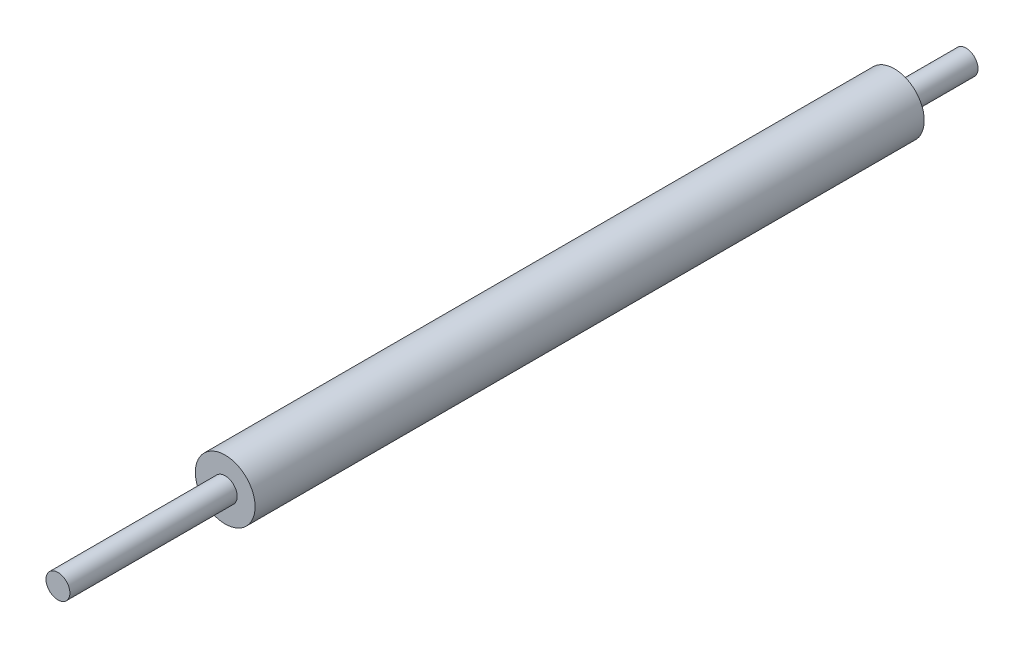
ISO-10303-21;
HEADER;
FILE_DESCRIPTION(('STEP AP214'),'2;1');
FILE_NAME('part.step','',(''),(''),'','','');
FILE_SCHEMA(('AUTOMOTIVE_DESIGN { 1 0 10303 214 1 1 1 1 }'));
ENDSEC;
DATA;
#1=APPLICATION_CONTEXT('core data for automotive mechanical design processes');
#2=APPLICATION_PROTOCOL_DEFINITION('international standard','automotive_design',2000,#1);
#3=PRODUCT_CONTEXT('',#1,'mechanical');
#4=PRODUCT('Part','Part','',(#3));
#5=PRODUCT_RELATED_PRODUCT_CATEGORY('part','',(#4));
#6=PRODUCT_DEFINITION_FORMATION('','',#4);
#7=PRODUCT_DEFINITION_CONTEXT('part definition',#1,'design');
#8=PRODUCT_DEFINITION('design','',#6,#7);
#9=PRODUCT_DEFINITION_SHAPE('','',#8);
#10=(LENGTH_UNIT() NAMED_UNIT(*) SI_UNIT(.MILLI.,.METRE.));
#11=(NAMED_UNIT(*) PLANE_ANGLE_UNIT() SI_UNIT($,.RADIAN.));
#12=(NAMED_UNIT(*) SI_UNIT($,.STERADIAN.) SOLID_ANGLE_UNIT());
#13=UNCERTAINTY_MEASURE_WITH_UNIT(LENGTH_MEASURE(1.E-05),#10,'distance_accuracy_value','');
#14=(GEOMETRIC_REPRESENTATION_CONTEXT(3) GLOBAL_UNCERTAINTY_ASSIGNED_CONTEXT((#13)) GLOBAL_UNIT_ASSIGNED_CONTEXT((#10,
#11,#12)) REPRESENTATION_CONTEXT('',''));
#15=CARTESIAN_POINT('',(0.,0.,0.));
#16=DIRECTION('',(0.,0.,1.));
#17=DIRECTION('',(1.,0.,0.));
#18=AXIS2_PLACEMENT_3D('',#15,#16,#17);
#19=CARTESIAN_POINT('',(0.,0.,280.));
#20=DIRECTION('',(0.,0.,-1.));
#21=DIRECTION('',(-1.,0.,0.));
#22=AXIS2_PLACEMENT_3D('',#19,#20,#21);
#23=CYLINDRICAL_SURFACE('',#22,12.5);
#24=CARTESIAN_POINT('',(0.,0.,280.));
#25=DIRECTION('',(0.,0.,1.));
#26=DIRECTION('',(1.,0.,0.));
#27=AXIS2_PLACEMENT_3D('',#24,#25,#26);
#28=CIRCLE('',#27,12.5);
#29=CARTESIAN_POINT('',(12.5,0.,280.));
#30=VERTEX_POINT('',#29);
#31=EDGE_CURVE('E51',#30,#30,#28,.T.);
#32=ORIENTED_EDGE('',*,*,#31,.F.);
#33=EDGE_LOOP('',(#32));
#34=FACE_BOUND('',#33,.T.);
#35=CARTESIAN_POINT('',(0.,0.,0.));
#36=DIRECTION('',(0.,0.,1.));
#37=DIRECTION('',(1.,0.,0.));
#38=AXIS2_PLACEMENT_3D('',#35,#36,#37);
#39=CIRCLE('',#38,12.5);
#40=CARTESIAN_POINT('',(12.5,0.,0.));
#41=VERTEX_POINT('',#40);
#42=EDGE_CURVE('E40',#41,#41,#39,.T.);
#43=ORIENTED_EDGE('',*,*,#42,.T.);
#44=EDGE_LOOP('',(#43));
#45=FACE_BOUND('',#44,.T.);
#46=ADVANCED_FACE('F37',(#34,#45),#23,.T.);
#47=CARTESIAN_POINT('',(0.,0.,280.));
#48=DIRECTION('',(0.,0.,1.));
#49=DIRECTION('',(1.,0.,0.));
#50=AXIS2_PLACEMENT_3D('',#47,#48,#49);
#51=PLANE('',#50);
#52=CARTESIAN_POINT('',(0.,0.,280.));
#53=DIRECTION('',(0.,0.,1.));
#54=DIRECTION('',(1.,0.,0.));
#55=AXIS2_PLACEMENT_3D('',#52,#53,#54);
#56=CIRCLE('',#55,5.);
#57=CARTESIAN_POINT('',(5.,0.,280.));
#58=VERTEX_POINT('',#57);
#59=EDGE_CURVE('E45',#58,#58,#56,.T.);
#60=ORIENTED_EDGE('',*,*,#59,.F.);
#61=EDGE_LOOP('',(#60));
#62=FACE_BOUND('',#61,.T.);
#63=ORIENTED_EDGE('',*,*,#31,.T.);
#64=EDGE_LOOP('',(#63));
#65=FACE_BOUND('',#64,.T.);
#66=ADVANCED_FACE('F71',(#62,#65),#51,.T.);
#67=CARTESIAN_POINT('',(0.,0.,0.));
#68=DIRECTION('',(0.,0.,1.));
#69=DIRECTION('',(1.,0.,0.));
#70=AXIS2_PLACEMENT_3D('',#67,#68,#69);
#71=PLANE('',#70);
#72=CARTESIAN_POINT('',(0.,0.,0.));
#73=DIRECTION('',(0.,0.,-1.));
#74=DIRECTION('',(-1.,0.,0.));
#75=AXIS2_PLACEMENT_3D('',#72,#73,#74);
#76=CIRCLE('',#75,5.);
#77=CARTESIAN_POINT('',(-5.,0.,0.));
#78=VERTEX_POINT('',#77);
#79=EDGE_CURVE('E10',#78,#78,#76,.T.);
#80=ORIENTED_EDGE('',*,*,#79,.F.);
#81=EDGE_LOOP('',(#80));
#82=FACE_BOUND('',#81,.T.);
#83=ORIENTED_EDGE('',*,*,#42,.F.);
#84=EDGE_LOOP('',(#83));
#85=FACE_BOUND('',#84,.T.);
#86=ADVANCED_FACE('F68',(#82,#85),#71,.F.);
#87=CARTESIAN_POINT('',(0.,0.,350.));
#88=DIRECTION('',(0.,0.,-1.));
#89=DIRECTION('',(-1.,0.,0.));
#90=AXIS2_PLACEMENT_3D('',#87,#88,#89);
#91=CYLINDRICAL_SURFACE('',#90,5.);
#92=CARTESIAN_POINT('',(0.,0.,350.));
#93=DIRECTION('',(0.,0.,1.));
#94=DIRECTION('',(1.,0.,0.));
#95=AXIS2_PLACEMENT_3D('',#92,#93,#94);
#96=CIRCLE('',#95,5.);
#97=CARTESIAN_POINT('',(5.,0.,350.));
#98=VERTEX_POINT('',#97);
#99=EDGE_CURVE('E56',#98,#98,#96,.T.);
#100=ORIENTED_EDGE('',*,*,#99,.F.);
#101=EDGE_LOOP('',(#100));
#102=FACE_BOUND('',#101,.T.);
#103=ORIENTED_EDGE('',*,*,#59,.T.);
#104=EDGE_LOOP('',(#103));
#105=FACE_BOUND('',#104,.T.);
#106=ADVANCED_FACE('F70',(#102,#105),#91,.T.);
#107=CARTESIAN_POINT('',(0.,0.,350.));
#108=DIRECTION('',(0.,0.,1.));
#109=DIRECTION('',(1.,0.,0.));
#110=AXIS2_PLACEMENT_3D('',#107,#108,#109);
#111=PLANE('',#110);
#112=ORIENTED_EDGE('',*,*,#99,.T.);
#113=EDGE_LOOP('',(#112));
#114=FACE_BOUND('',#113,.T.);
#115=ADVANCED_FACE('F77',(#114),#111,.T.);
#116=CARTESIAN_POINT('',(0.,0.,-30.));
#117=DIRECTION('',(0.,0.,1.));
#118=DIRECTION('',(1.,0.,0.));
#119=AXIS2_PLACEMENT_3D('',#116,#117,#118);
#120=CYLINDRICAL_SURFACE('',#119,5.);
#121=CARTESIAN_POINT('',(0.,0.,-30.));
#122=DIRECTION('',(0.,0.,-1.));
#123=DIRECTION('',(-1.,0.,0.));
#124=AXIS2_PLACEMENT_3D('',#121,#122,#123);
#125=CIRCLE('',#124,5.);
#126=CARTESIAN_POINT('',(-5.,0.,-30.));
#127=VERTEX_POINT('',#126);
#128=EDGE_CURVE('E55',#127,#127,#125,.T.);
#129=ORIENTED_EDGE('',*,*,#128,.F.);
#130=EDGE_LOOP('',(#129));
#131=FACE_BOUND('',#130,.T.);
#132=ORIENTED_EDGE('',*,*,#79,.T.);
#133=EDGE_LOOP('',(#132));
#134=FACE_BOUND('',#133,.T.);
#135=ADVANCED_FACE('F105',(#131,#134),#120,.T.);
#136=CARTESIAN_POINT('',(0.,0.,-30.));
#137=DIRECTION('',(0.,0.,-1.));
#138=DIRECTION('',(-1.,0.,0.));
#139=AXIS2_PLACEMENT_3D('',#136,#137,#138);
#140=PLANE('',#139);
#141=ORIENTED_EDGE('',*,*,#128,.T.);
#142=EDGE_LOOP('',(#141));
#143=FACE_BOUND('',#142,.T.);
#144=ADVANCED_FACE('F119',(#143),#140,.T.);
#145=CLOSED_SHELL('',(#46,#66,#86,#106,#115,#135,#144));
#146=MANIFOLD_SOLID_BREP('B2',#145);
#147=ADVANCED_BREP_SHAPE_REPRESENTATION('',(#18,#146),#14);
#148=SHAPE_DEFINITION_REPRESENTATION(#9,#147);
ENDSEC;
END-ISO-10303-21;
